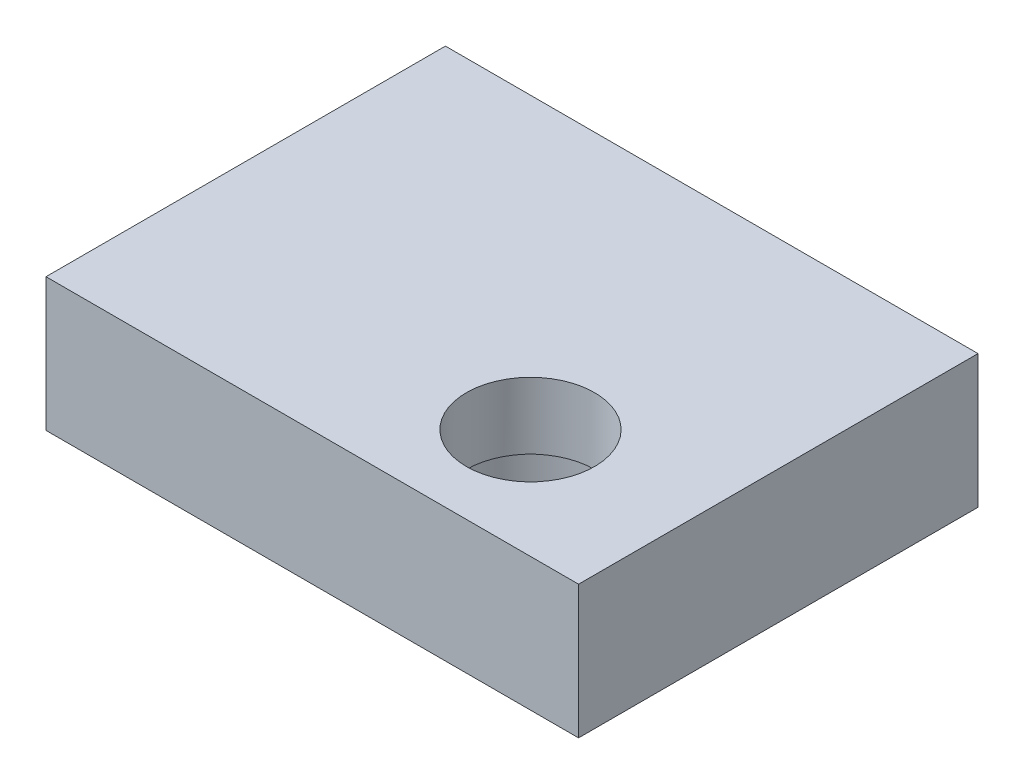
ISO-10303-21;
HEADER;
FILE_DESCRIPTION(('STEP AP214'),'2;1');
FILE_NAME('part.step','',(''),(''),'','','');
FILE_SCHEMA(('AUTOMOTIVE_DESIGN { 1 0 10303 214 1 1 1 1 }'));
ENDSEC;
DATA;
#1=APPLICATION_CONTEXT('core data for automotive mechanical design processes');
#2=APPLICATION_PROTOCOL_DEFINITION('international standard','automotive_design',2000,#1);
#3=PRODUCT_CONTEXT('',#1,'mechanical');
#4=PRODUCT('Part','Part','',(#3));
#5=PRODUCT_RELATED_PRODUCT_CATEGORY('part','',(#4));
#6=PRODUCT_DEFINITION_FORMATION('','',#4);
#7=PRODUCT_DEFINITION_CONTEXT('part definition',#1,'design');
#8=PRODUCT_DEFINITION('design','',#6,#7);
#9=PRODUCT_DEFINITION_SHAPE('','',#8);
#10=(LENGTH_UNIT() NAMED_UNIT(*) SI_UNIT(.MILLI.,.METRE.));
#11=(NAMED_UNIT(*) PLANE_ANGLE_UNIT() SI_UNIT($,.RADIAN.));
#12=(NAMED_UNIT(*) SI_UNIT($,.STERADIAN.) SOLID_ANGLE_UNIT());
#13=UNCERTAINTY_MEASURE_WITH_UNIT(LENGTH_MEASURE(1.E-05),#10,'distance_accuracy_value','');
#14=(GEOMETRIC_REPRESENTATION_CONTEXT(3) GLOBAL_UNCERTAINTY_ASSIGNED_CONTEXT((#13)) GLOBAL_UNIT_ASSIGNED_CONTEXT((#10,
#11,#12)) REPRESENTATION_CONTEXT('',''));
#15=CARTESIAN_POINT('',(0.,0.,0.));
#16=DIRECTION('',(0.,0.,1.));
#17=DIRECTION('',(1.,0.,0.));
#18=AXIS2_PLACEMENT_3D('',#15,#16,#17);
#19=CARTESIAN_POINT('',(20.,10.,15.));
#20=DIRECTION('',(-1.,0.,0.));
#21=DIRECTION('',(0.,0.,1.));
#22=AXIS2_PLACEMENT_3D('',#19,#20,#21);
#23=PLANE('',#22);
#24=DIRECTION('',(0.,0.,-1.));
#25=VECTOR('',#24,1.);
#26=CARTESIAN_POINT('',(20.,0.,15.));
#27=LINE('',#26,#25);
#28=CARTESIAN_POINT('',(20.,0.,15.));
#29=VERTEX_POINT('',#28);
#30=CARTESIAN_POINT('',(20.,0.,-15.));
#31=VERTEX_POINT('',#30);
#32=EDGE_CURVE('E116',#29,#31,#27,.T.);
#33=ORIENTED_EDGE('',*,*,#32,.T.);
#34=DIRECTION('',(0.,-1.,0.));
#35=VECTOR('',#34,1.);
#36=CARTESIAN_POINT('',(20.,10.,-15.));
#37=LINE('',#36,#35);
#38=CARTESIAN_POINT('',(20.,10.,-15.));
#39=VERTEX_POINT('',#38);
#40=EDGE_CURVE('E11',#39,#31,#37,.T.);
#41=ORIENTED_EDGE('',*,*,#40,.F.);
#42=DIRECTION('',(0.,0.,-1.));
#43=VECTOR('',#42,1.);
#44=CARTESIAN_POINT('',(20.,10.,15.));
#45=LINE('',#44,#43);
#46=CARTESIAN_POINT('',(20.,10.,15.));
#47=VERTEX_POINT('',#46);
#48=EDGE_CURVE('E99',#47,#39,#45,.T.);
#49=ORIENTED_EDGE('',*,*,#48,.F.);
#50=DIRECTION('',(0.,-1.,0.));
#51=VECTOR('',#50,1.);
#52=CARTESIAN_POINT('',(20.,10.,15.));
#53=LINE('',#52,#51);
#54=EDGE_CURVE('E112',#47,#29,#53,.T.);
#55=ORIENTED_EDGE('',*,*,#54,.T.);
#56=EDGE_LOOP('',(#33,#41,#49,#55));
#57=FACE_BOUND('',#56,.T.);
#58=ADVANCED_FACE('F46',(#57),#23,.F.);
#59=CARTESIAN_POINT('',(-20.,10.,-15.));
#60=DIRECTION('',(0.,0.,1.));
#61=DIRECTION('',(1.,0.,0.));
#62=AXIS2_PLACEMENT_3D('',#59,#60,#61);
#63=PLANE('',#62);
#64=DIRECTION('',(-1.,0.,0.));
#65=VECTOR('',#64,1.);
#66=CARTESIAN_POINT('',(-20.,0.,-15.));
#67=LINE('',#66,#65);
#68=CARTESIAN_POINT('',(-20.,0.,-15.));
#69=VERTEX_POINT('',#68);
#70=EDGE_CURVE('E104',#31,#69,#67,.T.);
#71=ORIENTED_EDGE('',*,*,#70,.T.);
#72=DIRECTION('',(0.,-1.,0.));
#73=VECTOR('',#72,1.);
#74=CARTESIAN_POINT('',(-20.,10.,-15.));
#75=LINE('',#74,#73);
#76=CARTESIAN_POINT('',(-20.,10.,-15.));
#77=VERTEX_POINT('',#76);
#78=EDGE_CURVE('E56',#77,#69,#75,.T.);
#79=ORIENTED_EDGE('',*,*,#78,.F.);
#80=DIRECTION('',(-1.,0.,0.));
#81=VECTOR('',#80,1.);
#82=CARTESIAN_POINT('',(-20.,10.,-15.));
#83=LINE('',#82,#81);
#84=EDGE_CURVE('E94',#39,#77,#83,.T.);
#85=ORIENTED_EDGE('',*,*,#84,.F.);
#86=ORIENTED_EDGE('',*,*,#40,.T.);
#87=EDGE_LOOP('',(#71,#79,#85,#86));
#88=FACE_BOUND('',#87,.T.);
#89=ADVANCED_FACE('F103',(#88),#63,.F.);
#90=CARTESIAN_POINT('',(-20.,10.,15.));
#91=DIRECTION('',(1.,0.,0.));
#92=DIRECTION('',(0.,0.,-1.));
#93=AXIS2_PLACEMENT_3D('',#90,#91,#92);
#94=PLANE('',#93);
#95=DIRECTION('',(0.,0.,1.));
#96=VECTOR('',#95,1.);
#97=CARTESIAN_POINT('',(-20.,0.,15.));
#98=LINE('',#97,#96);
#99=CARTESIAN_POINT('',(-20.,0.,15.));
#100=VERTEX_POINT('',#99);
#101=EDGE_CURVE('E81',#69,#100,#98,.T.);
#102=ORIENTED_EDGE('',*,*,#101,.T.);
#103=DIRECTION('',(0.,-1.,0.));
#104=VECTOR('',#103,1.);
#105=CARTESIAN_POINT('',(-20.,10.,15.));
#106=LINE('',#105,#104);
#107=CARTESIAN_POINT('',(-20.,10.,15.));
#108=VERTEX_POINT('',#107);
#109=EDGE_CURVE('E106',#108,#100,#106,.T.);
#110=ORIENTED_EDGE('',*,*,#109,.F.);
#111=DIRECTION('',(0.,0.,1.));
#112=VECTOR('',#111,1.);
#113=CARTESIAN_POINT('',(-20.,10.,15.));
#114=LINE('',#113,#112);
#115=EDGE_CURVE('E97',#77,#108,#114,.T.);
#116=ORIENTED_EDGE('',*,*,#115,.F.);
#117=ORIENTED_EDGE('',*,*,#78,.T.);
#118=EDGE_LOOP('',(#102,#110,#116,#117));
#119=FACE_BOUND('',#118,.T.);
#120=ADVANCED_FACE('F108',(#119),#94,.F.);
#121=CARTESIAN_POINT('',(-20.,10.,15.));
#122=DIRECTION('',(0.,0.,-1.));
#123=DIRECTION('',(-1.,0.,0.));
#124=AXIS2_PLACEMENT_3D('',#121,#122,#123);
#125=PLANE('',#124);
#126=DIRECTION('',(1.,0.,0.));
#127=VECTOR('',#126,1.);
#128=CARTESIAN_POINT('',(-20.,0.,15.));
#129=LINE('',#128,#127);
#130=EDGE_CURVE('E87',#100,#29,#129,.T.);
#131=ORIENTED_EDGE('',*,*,#130,.T.);
#132=ORIENTED_EDGE('',*,*,#54,.F.);
#133=DIRECTION('',(1.,0.,0.));
#134=VECTOR('',#133,1.);
#135=CARTESIAN_POINT('',(-20.,10.,15.));
#136=LINE('',#135,#134);
#137=EDGE_CURVE('E64',#108,#47,#136,.T.);
#138=ORIENTED_EDGE('',*,*,#137,.F.);
#139=ORIENTED_EDGE('',*,*,#109,.T.);
#140=EDGE_LOOP('',(#131,#132,#138,#139));
#141=FACE_BOUND('',#140,.T.);
#142=ADVANCED_FACE('F130',(#141),#125,.F.);
#143=CARTESIAN_POINT('',(0.,10.,0.));
#144=DIRECTION('',(0.,-1.,0.));
#145=DIRECTION('',(0.,0.,-1.));
#146=AXIS2_PLACEMENT_3D('',#143,#144,#145);
#147=PLANE('',#146);
#148=CARTESIAN_POINT('',(8.14,10.,6.75));
#149=DIRECTION('',(0.,1.,0.));
#150=DIRECTION('',(0.,0.,1.));
#151=AXIS2_PLACEMENT_3D('',#148,#149,#150);
#152=CIRCLE('',#151,4.8125);
#153=CARTESIAN_POINT('',(8.14,10.,11.5625));
#154=VERTEX_POINT('',#153);
#155=EDGE_CURVE('E168',#154,#154,#152,.T.);
#156=ORIENTED_EDGE('',*,*,#155,.F.);
#157=EDGE_LOOP('',(#156));
#158=FACE_BOUND('',#157,.T.);
#159=ORIENTED_EDGE('',*,*,#48,.T.);
#160=ORIENTED_EDGE('',*,*,#84,.T.);
#161=ORIENTED_EDGE('',*,*,#115,.T.);
#162=ORIENTED_EDGE('',*,*,#137,.T.);
#163=EDGE_LOOP('',(#159,#160,#161,#162));
#164=FACE_BOUND('',#163,.T.);
#165=ADVANCED_FACE('F95',(#158,#164),#147,.F.);
#166=CARTESIAN_POINT('',(0.,0.,0.));
#167=DIRECTION('',(0.,-1.,0.));
#168=DIRECTION('',(0.,0.,-1.));
#169=AXIS2_PLACEMENT_3D('',#166,#167,#168);
#170=PLANE('',#169);
#171=CARTESIAN_POINT('',(8.14,0.,6.75));
#172=DIRECTION('',(0.,-1.,0.));
#173=DIRECTION('',(0.,0.,-1.));
#174=AXIS2_PLACEMENT_3D('',#171,#172,#173);
#175=CIRCLE('',#174,6.25);
#176=CARTESIAN_POINT('',(8.14,0.,0.5));
#177=VERTEX_POINT('',#176);
#178=EDGE_CURVE('E149',#177,#177,#175,.T.);
#179=ORIENTED_EDGE('',*,*,#178,.F.);
#180=EDGE_LOOP('',(#179));
#181=FACE_BOUND('',#180,.T.);
#182=CARTESIAN_POINT('',(13.3333333333333,0.,-9.99999999999999));
#183=DIRECTION('',(0.,-1.,0.));
#184=DIRECTION('',(0.,0.,-1.));
#185=AXIS2_PLACEMENT_3D('',#182,#183,#184);
#186=CIRCLE('',#185,2.);
#187=CARTESIAN_POINT('',(13.3333333333333,0.,-12.));
#188=VERTEX_POINT('',#187);
#189=EDGE_CURVE('E157',#188,#188,#186,.T.);
#190=ORIENTED_EDGE('',*,*,#189,.F.);
#191=EDGE_LOOP('',(#190));
#192=FACE_BOUND('',#191,.T.);
#193=CARTESIAN_POINT('',(-13.3333333333333,0.,-9.99999999999999));
#194=DIRECTION('',(0.,-1.,0.));
#195=DIRECTION('',(0.,0.,1.));
#196=AXIS2_PLACEMENT_3D('',#193,#194,#195);
#197=CIRCLE('',#196,2.);
#198=CARTESIAN_POINT('',(-13.3333333333333,0.,-7.99999999999999));
#199=VERTEX_POINT('',#198);
#200=EDGE_CURVE('E141',#199,#199,#197,.T.);
#201=ORIENTED_EDGE('',*,*,#200,.F.);
#202=EDGE_LOOP('',(#201));
#203=FACE_BOUND('',#202,.T.);
#204=CARTESIAN_POINT('',(-13.3333333333333,0.,10.));
#205=DIRECTION('',(0.,-1.,0.));
#206=DIRECTION('',(0.,0.,-1.));
#207=AXIS2_PLACEMENT_3D('',#204,#205,#206);
#208=CIRCLE('',#207,2.);
#209=CARTESIAN_POINT('',(-13.3333333333333,0.,8.));
#210=VERTEX_POINT('',#209);
#211=EDGE_CURVE('E137',#210,#210,#208,.T.);
#212=ORIENTED_EDGE('',*,*,#211,.F.);
#213=EDGE_LOOP('',(#212));
#214=FACE_BOUND('',#213,.T.);
#215=ORIENTED_EDGE('',*,*,#32,.F.);
#216=ORIENTED_EDGE('',*,*,#130,.F.);
#217=ORIENTED_EDGE('',*,*,#101,.F.);
#218=ORIENTED_EDGE('',*,*,#70,.F.);
#219=EDGE_LOOP('',(#215,#216,#217,#218));
#220=FACE_BOUND('',#219,.T.);
#221=ADVANCED_FACE('F133',(#181,#192,#203,#214,#220),#170,.T.);
#222=CARTESIAN_POINT('',(-13.3333333333333,5.,10.));
#223=DIRECTION('',(0.,-1.,0.));
#224=DIRECTION('',(0.,0.,-1.));
#225=AXIS2_PLACEMENT_3D('',#222,#223,#224);
#226=CYLINDRICAL_SURFACE('',#225,2.);
#227=CARTESIAN_POINT('',(-13.3333333333333,5.,10.));
#228=DIRECTION('',(0.,-1.,0.));
#229=DIRECTION('',(0.,0.,-1.));
#230=AXIS2_PLACEMENT_3D('',#227,#228,#229);
#231=CIRCLE('',#230,2.);
#232=CARTESIAN_POINT('',(-13.3333333333333,5.,8.));
#233=VERTEX_POINT('',#232);
#234=EDGE_CURVE('E120',#233,#233,#231,.T.);
#235=ORIENTED_EDGE('',*,*,#234,.F.);
#236=EDGE_LOOP('',(#235));
#237=FACE_BOUND('',#236,.T.);
#238=ORIENTED_EDGE('',*,*,#211,.T.);
#239=EDGE_LOOP('',(#238));
#240=FACE_BOUND('',#239,.T.);
#241=ADVANCED_FACE('F194',(#237,#240),#226,.F.);
#242=CARTESIAN_POINT('',(-13.3333333333333,5.,10.));
#243=DIRECTION('',(0.,-1.,0.));
#244=DIRECTION('',(0.,0.,-1.));
#245=AXIS2_PLACEMENT_3D('',#242,#243,#244);
#246=PLANE('',#245);
#247=ORIENTED_EDGE('',*,*,#234,.T.);
#248=EDGE_LOOP('',(#247));
#249=FACE_BOUND('',#248,.T.);
#250=ADVANCED_FACE('F203',(#249),#246,.T.);
#251=CARTESIAN_POINT('',(-13.3333333333333,5.,-9.99999999999999));
#252=DIRECTION('',(0.,-1.,0.));
#253=DIRECTION('',(0.,0.,-1.));
#254=AXIS2_PLACEMENT_3D('',#251,#252,#253);
#255=CYLINDRICAL_SURFACE('',#254,2.);
#256=CARTESIAN_POINT('',(-13.3333333333333,5.,-9.99999999999999));
#257=DIRECTION('',(0.,-1.,0.));
#258=DIRECTION('',(0.,0.,1.));
#259=AXIS2_PLACEMENT_3D('',#256,#257,#258);
#260=CIRCLE('',#259,2.);
#261=CARTESIAN_POINT('',(-13.3333333333333,5.,-7.99999999999999));
#262=VERTEX_POINT('',#261);
#263=EDGE_CURVE('E161',#262,#262,#260,.T.);
#264=ORIENTED_EDGE('',*,*,#263,.F.);
#265=EDGE_LOOP('',(#264));
#266=FACE_BOUND('',#265,.T.);
#267=ORIENTED_EDGE('',*,*,#200,.T.);
#268=EDGE_LOOP('',(#267));
#269=FACE_BOUND('',#268,.T.);
#270=ADVANCED_FACE('F209',(#266,#269),#255,.F.);
#271=CARTESIAN_POINT('',(-13.3333333333333,5.,-9.99999999999999));
#272=DIRECTION('',(0.,1.,0.));
#273=DIRECTION('',(0.,0.,1.));
#274=AXIS2_PLACEMENT_3D('',#271,#272,#273);
#275=PLANE('',#274);
#276=ORIENTED_EDGE('',*,*,#263,.T.);
#277=EDGE_LOOP('',(#276));
#278=FACE_BOUND('',#277,.T.);
#279=ADVANCED_FACE('F267',(#278),#275,.F.);
#280=CARTESIAN_POINT('',(13.3333333333333,5.,-9.99999999999999));
#281=DIRECTION('',(0.,-1.,0.));
#282=DIRECTION('',(0.,0.,-1.));
#283=AXIS2_PLACEMENT_3D('',#280,#281,#282);
#284=CYLINDRICAL_SURFACE('',#283,2.);
#285=CARTESIAN_POINT('',(13.3333333333333,5.,-9.99999999999999));
#286=DIRECTION('',(0.,-1.,0.));
#287=DIRECTION('',(0.,0.,-1.));
#288=AXIS2_PLACEMENT_3D('',#285,#286,#287);
#289=CIRCLE('',#288,2.);
#290=CARTESIAN_POINT('',(13.3333333333333,5.,-12.));
#291=VERTEX_POINT('',#290);
#292=EDGE_CURVE('E153',#291,#291,#289,.T.);
#293=ORIENTED_EDGE('',*,*,#292,.F.);
#294=EDGE_LOOP('',(#293));
#295=FACE_BOUND('',#294,.T.);
#296=ORIENTED_EDGE('',*,*,#189,.T.);
#297=EDGE_LOOP('',(#296));
#298=FACE_BOUND('',#297,.T.);
#299=ADVANCED_FACE('F258',(#295,#298),#284,.F.);
#300=CARTESIAN_POINT('',(13.3333333333333,5.,-9.99999999999999));
#301=DIRECTION('',(0.,-1.,0.));
#302=DIRECTION('',(0.,0.,-1.));
#303=AXIS2_PLACEMENT_3D('',#300,#301,#302);
#304=PLANE('',#303);
#305=ORIENTED_EDGE('',*,*,#292,.T.);
#306=EDGE_LOOP('',(#305));
#307=FACE_BOUND('',#306,.T.);
#308=ADVANCED_FACE('F188',(#307),#304,.T.);
#309=CARTESIAN_POINT('',(8.14,5.,6.75));
#310=DIRECTION('',(0.,-1.,0.));
#311=DIRECTION('',(0.,0.,-1.));
#312=AXIS2_PLACEMENT_3D('',#309,#310,#311);
#313=CYLINDRICAL_SURFACE('',#312,6.25);
#314=CARTESIAN_POINT('',(8.14,5.,6.75));
#315=DIRECTION('',(0.,-1.,0.));
#316=DIRECTION('',(0.,0.,-1.));
#317=AXIS2_PLACEMENT_3D('',#314,#315,#316);
#318=CIRCLE('',#317,6.25);
#319=CARTESIAN_POINT('',(8.14,5.,0.5));
#320=VERTEX_POINT('',#319);
#321=EDGE_CURVE('E145',#320,#320,#318,.T.);
#322=ORIENTED_EDGE('',*,*,#321,.F.);
#323=EDGE_LOOP('',(#322));
#324=FACE_BOUND('',#323,.T.);
#325=ORIENTED_EDGE('',*,*,#178,.T.);
#326=EDGE_LOOP('',(#325));
#327=FACE_BOUND('',#326,.T.);
#328=ADVANCED_FACE('F182',(#324,#327),#313,.F.);
#329=CARTESIAN_POINT('',(8.14,5.,6.75));
#330=DIRECTION('',(0.,-1.,0.));
#331=DIRECTION('',(0.,0.,-1.));
#332=AXIS2_PLACEMENT_3D('',#329,#330,#331);
#333=PLANE('',#332);
#334=CARTESIAN_POINT('',(8.14,5.,6.75));
#335=DIRECTION('',(0.,-1.,0.));
#336=DIRECTION('',(0.,0.,-1.));
#337=AXIS2_PLACEMENT_3D('',#334,#335,#336);
#338=CIRCLE('',#337,4.8125);
#339=CARTESIAN_POINT('',(8.14,5.,1.9375));
#340=VERTEX_POINT('',#339);
#341=EDGE_CURVE('E49',#340,#340,#338,.T.);
#342=ORIENTED_EDGE('',*,*,#341,.F.);
#343=EDGE_LOOP('',(#342));
#344=FACE_BOUND('',#343,.T.);
#345=ORIENTED_EDGE('',*,*,#321,.T.);
#346=EDGE_LOOP('',(#345));
#347=FACE_BOUND('',#346,.T.);
#348=ADVANCED_FACE('F179',(#344,#347),#333,.T.);
#349=CARTESIAN_POINT('',(8.14,-13.611805537841,6.75));
#350=DIRECTION('',(0.,1.,0.));
#351=DIRECTION('',(0.,0.,1.));
#352=AXIS2_PLACEMENT_3D('',#349,#350,#351);
#353=CYLINDRICAL_SURFACE('',#352,4.8125);
#354=ORIENTED_EDGE('',*,*,#341,.T.);
#355=EDGE_LOOP('',(#354));
#356=FACE_BOUND('',#355,.T.);
#357=ORIENTED_EDGE('',*,*,#155,.T.);
#358=EDGE_LOOP('',(#357));
#359=FACE_BOUND('',#358,.T.);
#360=ADVANCED_FACE('F177',(#356,#359),#353,.F.);
#361=CLOSED_SHELL('',(#58,#89,#120,#142,#165,#221,#241,#250,#270,#279,#299,#308,#328,#348,#360));
#362=MANIFOLD_SOLID_BREP('B2',#361);
#363=ADVANCED_BREP_SHAPE_REPRESENTATION('',(#18,#362),#14);
#364=SHAPE_DEFINITION_REPRESENTATION(#9,#363);
ENDSEC;
END-ISO-10303-21;
